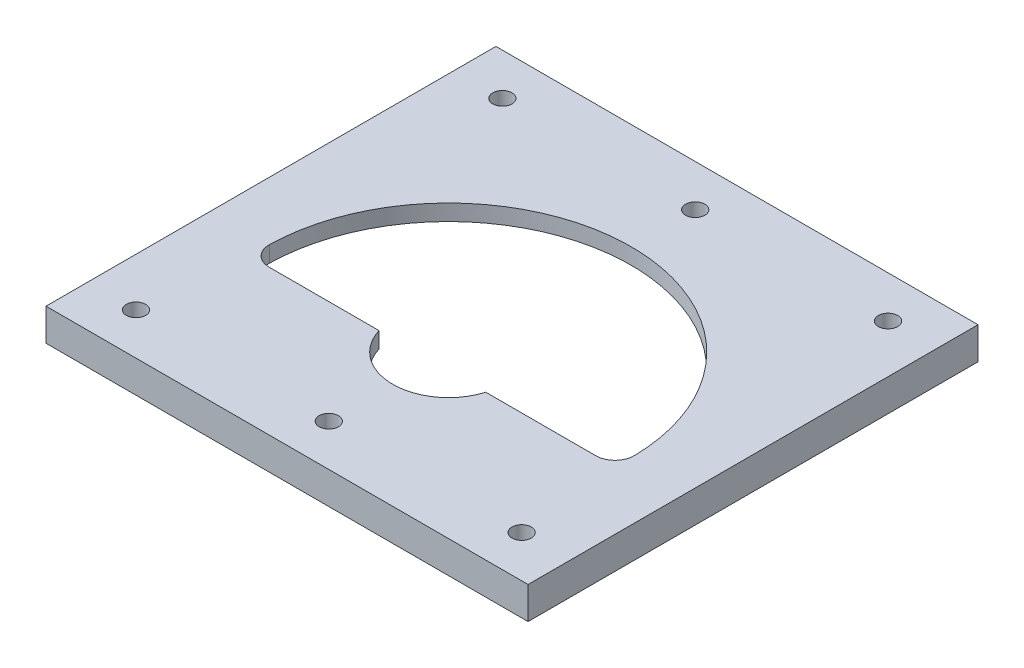
ISO-10303-21;
HEADER;
FILE_DESCRIPTION(('STEP AP214'),'2;1');
FILE_NAME('part.step','',(''),(''),'','','');
FILE_SCHEMA(('AUTOMOTIVE_DESIGN { 1 0 10303 214 1 1 1 1 }'));
ENDSEC;
DATA;
#1=APPLICATION_CONTEXT('core data for automotive mechanical design processes');
#2=APPLICATION_PROTOCOL_DEFINITION('international standard','automotive_design',2000,#1);
#3=PRODUCT_CONTEXT('',#1,'mechanical');
#4=PRODUCT('Part','Part','',(#3));
#5=PRODUCT_RELATED_PRODUCT_CATEGORY('part','',(#4));
#6=PRODUCT_DEFINITION_FORMATION('','',#4);
#7=PRODUCT_DEFINITION_CONTEXT('part definition',#1,'design');
#8=PRODUCT_DEFINITION('design','',#6,#7);
#9=PRODUCT_DEFINITION_SHAPE('','',#8);
#10=(LENGTH_UNIT() NAMED_UNIT(*) SI_UNIT(.MILLI.,.METRE.));
#11=(NAMED_UNIT(*) PLANE_ANGLE_UNIT() SI_UNIT($,.RADIAN.));
#12=(NAMED_UNIT(*) SI_UNIT($,.STERADIAN.) SOLID_ANGLE_UNIT());
#13=UNCERTAINTY_MEASURE_WITH_UNIT(LENGTH_MEASURE(1.E-05),#10,'distance_accuracy_value','');
#14=(GEOMETRIC_REPRESENTATION_CONTEXT(3) GLOBAL_UNCERTAINTY_ASSIGNED_CONTEXT((#13)) GLOBAL_UNIT_ASSIGNED_CONTEXT((#10,
#11,#12)) REPRESENTATION_CONTEXT('',''));
#15=CARTESIAN_POINT('',(0.,0.,0.));
#16=DIRECTION('',(0.,0.,1.));
#17=DIRECTION('',(1.,0.,0.));
#18=AXIS2_PLACEMENT_3D('',#15,#16,#17);
#19=CARTESIAN_POINT('',(25.4100183420751,5.,-0.5));
#20=DIRECTION('',(0.,-1.,0.));
#21=DIRECTION('',(0.,0.,-1.));
#22=AXIS2_PLACEMENT_3D('',#19,#20,#21);
#23=CYLINDRICAL_SURFACE('',#22,3.);
#24=DIRECTION('',(0.,-1.,0.));
#25=VECTOR('',#24,1.);
#26=CARTESIAN_POINT('',(28.4094377177648,5.,-0.559020409495822));
#27=LINE('',#26,#25);
#28=CARTESIAN_POINT('',(28.4094377177648,5.,-0.559020409495822));
#29=VERTEX_POINT('',#28);
#30=CARTESIAN_POINT('',(28.4094377177648,2.5,-0.559020409495822));
#31=VERTEX_POINT('',#30);
#32=EDGE_CURVE('E280',#29,#31,#27,.T.);
#33=ORIENTED_EDGE('',*,*,#32,.T.);
#34=CARTESIAN_POINT('',(25.4100183420751,2.5,-0.5));
#35=DIRECTION('',(0.,-1.,0.));
#36=DIRECTION('',(0.,0.,-1.));
#37=AXIS2_PLACEMENT_3D('',#34,#35,#36);
#38=CIRCLE('',#37,3.);
#39=CARTESIAN_POINT('',(25.4100183420751,2.5,2.5));
#40=VERTEX_POINT('',#39);
#41=EDGE_CURVE('E213',#31,#40,#38,.T.);
#42=ORIENTED_EDGE('',*,*,#41,.T.);
#43=DIRECTION('',(0.,-1.,0.));
#44=VECTOR('',#43,1.);
#45=CARTESIAN_POINT('',(25.4100183420751,5.,2.5));
#46=LINE('',#45,#44);
#47=CARTESIAN_POINT('',(25.4100183420751,5.,2.5));
#48=VERTEX_POINT('',#47);
#49=EDGE_CURVE('E265',#48,#40,#46,.T.);
#50=ORIENTED_EDGE('',*,*,#49,.F.);
#51=CARTESIAN_POINT('',(25.4100183420751,5.,-0.5));
#52=DIRECTION('',(0.,1.,0.));
#53=DIRECTION('',(0.,0.,1.));
#54=AXIS2_PLACEMENT_3D('',#51,#52,#53);
#55=CIRCLE('',#54,3.);
#56=EDGE_CURVE('E250',#48,#29,#55,.T.);
#57=ORIENTED_EDGE('',*,*,#56,.T.);
#58=EDGE_LOOP('',(#33,#42,#50,#57));
#59=FACE_BOUND('',#58,.T.);
#60=ADVANCED_FACE('F37',(#59),#23,.F.);
#61=CARTESIAN_POINT('',(0.,5.,0.));
#62=DIRECTION('',(0.,-1.,0.));
#63=DIRECTION('',(0.,0.,-1.));
#64=AXIS2_PLACEMENT_3D('',#61,#62,#63);
#65=CYLINDRICAL_SURFACE('',#64,28.4149371855331);
#66=DIRECTION('',(0.,-1.,0.));
#67=VECTOR('',#66,1.);
#68=CARTESIAN_POINT('',(-28.4094377177648,5.,-0.55902040949581));
#69=LINE('',#68,#67);
#70=CARTESIAN_POINT('',(-28.4094377177648,5.,-0.55902040949581));
#71=VERTEX_POINT('',#70);
#72=CARTESIAN_POINT('',(-28.4094377177648,2.5,-0.55902040949581));
#73=VERTEX_POINT('',#72);
#74=EDGE_CURVE('E277',#71,#73,#69,.T.);
#75=ORIENTED_EDGE('',*,*,#74,.T.);
#76=CARTESIAN_POINT('',(0.,2.5,0.));
#77=DIRECTION('',(0.,-1.,0.));
#78=DIRECTION('',(0.,0.,-1.));
#79=AXIS2_PLACEMENT_3D('',#76,#77,#78);
#80=CIRCLE('',#79,28.4149371855331);
#81=EDGE_CURVE('E210',#73,#31,#80,.T.);
#82=ORIENTED_EDGE('',*,*,#81,.T.);
#83=ORIENTED_EDGE('',*,*,#32,.F.);
#84=CARTESIAN_POINT('',(0.,5.,0.));
#85=DIRECTION('',(0.,1.,0.));
#86=DIRECTION('',(0.,0.,1.));
#87=AXIS2_PLACEMENT_3D('',#84,#85,#86);
#88=CIRCLE('',#87,28.4149371855331);
#89=EDGE_CURVE('E254',#29,#71,#88,.T.);
#90=ORIENTED_EDGE('',*,*,#89,.T.);
#91=EDGE_LOOP('',(#75,#82,#83,#90));
#92=FACE_BOUND('',#91,.T.);
#93=ADVANCED_FACE('F345',(#92),#65,.F.);
#94=CARTESIAN_POINT('',(-25.4100183420751,5.,-0.5));
#95=DIRECTION('',(0.,-1.,0.));
#96=DIRECTION('',(0.,0.,-1.));
#97=AXIS2_PLACEMENT_3D('',#94,#95,#96);
#98=CYLINDRICAL_SURFACE('',#97,3.);
#99=DIRECTION('',(0.,-1.,0.));
#100=VECTOR('',#99,1.);
#101=CARTESIAN_POINT('',(-25.4100183420751,5.,2.5));
#102=LINE('',#101,#100);
#103=CARTESIAN_POINT('',(-25.4100183420751,5.,2.5));
#104=VERTEX_POINT('',#103);
#105=CARTESIAN_POINT('',(-25.4100183420751,2.5,2.5));
#106=VERTEX_POINT('',#105);
#107=EDGE_CURVE('E274',#104,#106,#102,.T.);
#108=ORIENTED_EDGE('',*,*,#107,.T.);
#109=CARTESIAN_POINT('',(-25.4100183420751,2.5,-0.5));
#110=DIRECTION('',(0.,-1.,0.));
#111=DIRECTION('',(0.,0.,-1.));
#112=AXIS2_PLACEMENT_3D('',#109,#110,#111);
#113=CIRCLE('',#112,3.);
#114=EDGE_CURVE('E207',#106,#73,#113,.T.);
#115=ORIENTED_EDGE('',*,*,#114,.T.);
#116=ORIENTED_EDGE('',*,*,#74,.F.);
#117=CARTESIAN_POINT('',(-25.4100183420751,5.,-0.5));
#118=DIRECTION('',(0.,1.,0.));
#119=DIRECTION('',(0.,0.,1.));
#120=AXIS2_PLACEMENT_3D('',#117,#118,#119);
#121=CIRCLE('',#120,3.);
#122=EDGE_CURVE('E256',#71,#104,#121,.T.);
#123=ORIENTED_EDGE('',*,*,#122,.T.);
#124=EDGE_LOOP('',(#108,#115,#116,#123));
#125=FACE_BOUND('',#124,.T.);
#126=ADVANCED_FACE('F348',(#125),#98,.F.);
#127=CARTESIAN_POINT('',(-25.4100183420751,5.,2.5));
#128=DIRECTION('',(0.,0.,-1.));
#129=DIRECTION('',(-1.,0.,0.));
#130=AXIS2_PLACEMENT_3D('',#127,#128,#129);
#131=PLANE('',#130);
#132=DIRECTION('',(0.,-1.,0.));
#133=VECTOR('',#132,1.);
#134=CARTESIAN_POINT('',(-8.30696244122964,5.,2.5));
#135=LINE('',#134,#133);
#136=CARTESIAN_POINT('',(-8.30696244122964,5.,2.5));
#137=VERTEX_POINT('',#136);
#138=CARTESIAN_POINT('',(-8.30696244122964,2.5,2.5));
#139=VERTEX_POINT('',#138);
#140=EDGE_CURVE('E271',#137,#139,#135,.T.);
#141=ORIENTED_EDGE('',*,*,#140,.T.);
#142=DIRECTION('',(-1.,0.,0.));
#143=VECTOR('',#142,1.);
#144=CARTESIAN_POINT('',(-25.4100183420751,2.5,2.5));
#145=LINE('',#144,#143);
#146=EDGE_CURVE('E204',#139,#106,#145,.T.);
#147=ORIENTED_EDGE('',*,*,#146,.T.);
#148=ORIENTED_EDGE('',*,*,#107,.F.);
#149=DIRECTION('',(1.,0.,0.));
#150=VECTOR('',#149,1.);
#151=CARTESIAN_POINT('',(-25.4100183420751,5.,2.5));
#152=LINE('',#151,#150);
#153=EDGE_CURVE('E258',#104,#137,#152,.T.);
#154=ORIENTED_EDGE('',*,*,#153,.T.);
#155=EDGE_LOOP('',(#141,#147,#148,#154));
#156=FACE_BOUND('',#155,.T.);
#157=ADVANCED_FACE('F352',(#156),#131,.T.);
#158=CARTESIAN_POINT('',(0.,5.,0.));
#159=DIRECTION('',(0.,-1.,0.));
#160=DIRECTION('',(0.,0.,-1.));
#161=AXIS2_PLACEMENT_3D('',#158,#159,#160);
#162=CYLINDRICAL_SURFACE('',#161,8.675);
#163=DIRECTION('',(0.,-1.,0.));
#164=VECTOR('',#163,1.);
#165=CARTESIAN_POINT('',(8.30696244122965,5.,2.5));
#166=LINE('',#165,#164);
#167=CARTESIAN_POINT('',(8.30696244122965,5.,2.5));
#168=VERTEX_POINT('',#167);
#169=CARTESIAN_POINT('',(8.30696244122965,2.5,2.5));
#170=VERTEX_POINT('',#169);
#171=EDGE_CURVE('E268',#168,#170,#166,.T.);
#172=ORIENTED_EDGE('',*,*,#171,.T.);
#173=CARTESIAN_POINT('',(0.,2.5,0.));
#174=DIRECTION('',(0.,-1.,0.));
#175=DIRECTION('',(0.,0.,-1.));
#176=AXIS2_PLACEMENT_3D('',#173,#174,#175);
#177=CIRCLE('',#176,8.675);
#178=EDGE_CURVE('E60',#170,#139,#177,.T.);
#179=ORIENTED_EDGE('',*,*,#178,.T.);
#180=ORIENTED_EDGE('',*,*,#140,.F.);
#181=CARTESIAN_POINT('',(0.,5.,0.));
#182=DIRECTION('',(0.,1.,0.));
#183=DIRECTION('',(0.,0.,1.));
#184=AXIS2_PLACEMENT_3D('',#181,#182,#183);
#185=CIRCLE('',#184,8.675);
#186=EDGE_CURVE('E260',#137,#168,#185,.T.);
#187=ORIENTED_EDGE('',*,*,#186,.T.);
#188=EDGE_LOOP('',(#172,#179,#180,#187));
#189=FACE_BOUND('',#188,.T.);
#190=ADVANCED_FACE('F355',(#189),#162,.F.);
#191=CARTESIAN_POINT('',(8.30696244122964,5.,2.5));
#192=DIRECTION('',(0.,0.,-1.));
#193=DIRECTION('',(-1.,0.,0.));
#194=AXIS2_PLACEMENT_3D('',#191,#192,#193);
#195=PLANE('',#194);
#196=ORIENTED_EDGE('',*,*,#49,.T.);
#197=DIRECTION('',(-1.,0.,0.));
#198=VECTOR('',#197,1.);
#199=CARTESIAN_POINT('',(8.30696244122964,2.5,2.5));
#200=LINE('',#199,#198);
#201=EDGE_CURVE('E11',#40,#170,#200,.T.);
#202=ORIENTED_EDGE('',*,*,#201,.T.);
#203=ORIENTED_EDGE('',*,*,#171,.F.);
#204=DIRECTION('',(1.,0.,0.));
#205=VECTOR('',#204,1.);
#206=CARTESIAN_POINT('',(8.30696244122964,5.,2.5));
#207=LINE('',#206,#205);
#208=EDGE_CURVE('E263',#168,#48,#207,.T.);
#209=ORIENTED_EDGE('',*,*,#208,.T.);
#210=EDGE_LOOP('',(#196,#202,#203,#209));
#211=FACE_BOUND('',#210,.T.);
#212=ADVANCED_FACE('F333',(#211),#195,.T.);
#213=CARTESIAN_POINT('',(0.,5.,0.));
#214=DIRECTION('',(0.,-1.,0.));
#215=DIRECTION('',(0.,0.,-1.));
#216=AXIS2_PLACEMENT_3D('',#213,#214,#215);
#217=PLANE('',#216);
#218=CARTESIAN_POINT('',(-30.,5.,18.6175));
#219=DIRECTION('',(0.,1.,0.));
#220=DIRECTION('',(0.,0.,1.));
#221=AXIS2_PLACEMENT_3D('',#218,#219,#220);
#222=CIRCLE('',#221,1.5);
#223=CARTESIAN_POINT('',(-30.,5.,20.1175));
#224=VERTEX_POINT('',#223);
#225=EDGE_CURVE('E227',#224,#224,#222,.T.);
#226=ORIENTED_EDGE('',*,*,#225,.F.);
#227=EDGE_LOOP('',(#226));
#228=FACE_BOUND('',#227,.T.);
#229=CARTESIAN_POINT('',(0.,5.,18.6175));
#230=DIRECTION('',(0.,1.,0.));
#231=DIRECTION('',(0.,0.,1.));
#232=AXIS2_PLACEMENT_3D('',#229,#230,#231);
#233=CIRCLE('',#232,1.5);
#234=CARTESIAN_POINT('',(0.,5.,20.1175));
#235=VERTEX_POINT('',#234);
#236=EDGE_CURVE('E233',#235,#235,#233,.T.);
#237=ORIENTED_EDGE('',*,*,#236,.F.);
#238=EDGE_LOOP('',(#237));
#239=FACE_BOUND('',#238,.T.);
#240=CARTESIAN_POINT('',(30.,5.,18.6175));
#241=DIRECTION('',(0.,1.,0.));
#242=DIRECTION('',(0.,0.,1.));
#243=AXIS2_PLACEMENT_3D('',#240,#241,#242);
#244=CIRCLE('',#243,1.50000000000001);
#245=CARTESIAN_POINT('',(30.,5.,20.1175));
#246=VERTEX_POINT('',#245);
#247=EDGE_CURVE('E239',#246,#246,#244,.T.);
#248=ORIENTED_EDGE('',*,*,#247,.F.);
#249=EDGE_LOOP('',(#248));
#250=FACE_BOUND('',#249,.T.);
#251=CARTESIAN_POINT('',(30.,5.,-38.3825));
#252=DIRECTION('',(0.,1.,0.));
#253=DIRECTION('',(0.,0.,1.));
#254=AXIS2_PLACEMENT_3D('',#251,#252,#253);
#255=CIRCLE('',#254,1.50000000000001);
#256=CARTESIAN_POINT('',(30.,5.,-36.8825));
#257=VERTEX_POINT('',#256);
#258=EDGE_CURVE('E220',#257,#257,#255,.T.);
#259=ORIENTED_EDGE('',*,*,#258,.F.);
#260=EDGE_LOOP('',(#259));
#261=FACE_BOUND('',#260,.T.);
#262=CARTESIAN_POINT('',(0.,5.,-38.3825));
#263=DIRECTION('',(0.,1.,0.));
#264=DIRECTION('',(0.,0.,1.));
#265=AXIS2_PLACEMENT_3D('',#262,#263,#264);
#266=CIRCLE('',#265,1.5);
#267=CARTESIAN_POINT('',(0.,5.,-36.8825));
#268=VERTEX_POINT('',#267);
#269=EDGE_CURVE('E216',#268,#268,#266,.T.);
#270=ORIENTED_EDGE('',*,*,#269,.F.);
#271=EDGE_LOOP('',(#270));
#272=FACE_BOUND('',#271,.T.);
#273=CARTESIAN_POINT('',(-30.,5.,-38.3825));
#274=DIRECTION('',(0.,1.,0.));
#275=DIRECTION('',(0.,0.,1.));
#276=AXIS2_PLACEMENT_3D('',#273,#274,#275);
#277=CIRCLE('',#276,1.5);
#278=CARTESIAN_POINT('',(-30.,5.,-36.8825000000001));
#279=VERTEX_POINT('',#278);
#280=EDGE_CURVE('E226',#279,#279,#277,.T.);
#281=ORIENTED_EDGE('',*,*,#280,.F.);
#282=EDGE_LOOP('',(#281));
#283=FACE_BOUND('',#282,.T.);
#284=DIRECTION('',(0.,0.,1.));
#285=VECTOR('',#284,1.);
#286=CARTESIAN_POINT('',(-37.5,5.,25.1175));
#287=LINE('',#286,#285);
#288=CARTESIAN_POINT('',(-37.5,5.,-44.8825000000001));
#289=VERTEX_POINT('',#288);
#290=CARTESIAN_POINT('',(-37.5,5.,25.1175));
#291=VERTEX_POINT('',#290);
#292=EDGE_CURVE('E284',#289,#291,#287,.T.);
#293=ORIENTED_EDGE('',*,*,#292,.T.);
#294=DIRECTION('',(1.,0.,0.));
#295=VECTOR('',#294,1.);
#296=CARTESIAN_POINT('',(-37.5,5.,25.1175));
#297=LINE('',#296,#295);
#298=CARTESIAN_POINT('',(37.5,5.,25.1175));
#299=VERTEX_POINT('',#298);
#300=EDGE_CURVE('E287',#291,#299,#297,.T.);
#301=ORIENTED_EDGE('',*,*,#300,.T.);
#302=DIRECTION('',(0.,0.,-1.));
#303=VECTOR('',#302,1.);
#304=CARTESIAN_POINT('',(37.5,5.,25.1175));
#305=LINE('',#304,#303);
#306=CARTESIAN_POINT('',(37.5,5.,-44.8825000000001));
#307=VERTEX_POINT('',#306);
#308=EDGE_CURVE('E290',#299,#307,#305,.T.);
#309=ORIENTED_EDGE('',*,*,#308,.T.);
#310=DIRECTION('',(-1.,0.,0.));
#311=VECTOR('',#310,1.);
#312=CARTESIAN_POINT('',(-37.5,5.,-44.8825000000001));
#313=LINE('',#312,#311);
#314=EDGE_CURVE('E292',#307,#289,#313,.T.);
#315=ORIENTED_EDGE('',*,*,#314,.T.);
#316=EDGE_LOOP('',(#293,#301,#309,#315));
#317=FACE_BOUND('',#316,.T.);
#318=ORIENTED_EDGE('',*,*,#56,.F.);
#319=ORIENTED_EDGE('',*,*,#208,.F.);
#320=ORIENTED_EDGE('',*,*,#186,.F.);
#321=ORIENTED_EDGE('',*,*,#153,.F.);
#322=ORIENTED_EDGE('',*,*,#122,.F.);
#323=ORIENTED_EDGE('',*,*,#89,.F.);
#324=EDGE_LOOP('',(#318,#319,#320,#321,#322,#323));
#325=FACE_BOUND('',#324,.T.);
#326=ADVANCED_FACE('F330',(#228,#239,#250,#261,#272,#283,#317,#325),#217,.F.);
#327=CARTESIAN_POINT('',(0.,0.,0.));
#328=DIRECTION('',(0.,-1.,0.));
#329=DIRECTION('',(0.,0.,-1.));
#330=AXIS2_PLACEMENT_3D('',#327,#328,#329);
#331=PLANE('',#330);
#332=CARTESIAN_POINT('',(0.,0.,0.));
#333=DIRECTION('',(0.,-1.,0.));
#334=DIRECTION('',(0.,0.,-1.));
#335=AXIS2_PLACEMENT_3D('',#332,#333,#334);
#336=CIRCLE('',#335,13.675);
#337=CARTESIAN_POINT('',(11.4348425874605,0.,7.5));
#338=VERTEX_POINT('',#337);
#339=CARTESIAN_POINT('',(-11.4348425874605,0.,7.5));
#340=VERTEX_POINT('',#339);
#341=EDGE_CURVE('E52',#338,#340,#336,.T.);
#342=ORIENTED_EDGE('',*,*,#341,.F.);
#343=DIRECTION('',(-1.,0.,0.));
#344=VECTOR('',#343,1.);
#345=CARTESIAN_POINT('',(25.4100183420751,0.,7.5));
#346=LINE('',#345,#344);
#347=CARTESIAN_POINT('',(25.4100183420751,0.,7.5));
#348=VERTEX_POINT('',#347);
#349=EDGE_CURVE('E170',#348,#338,#346,.T.);
#350=ORIENTED_EDGE('',*,*,#349,.F.);
#351=CARTESIAN_POINT('',(25.4100183420751,0.,-0.5));
#352=DIRECTION('',(0.,-1.,0.));
#353=DIRECTION('',(0.,0.,-1.));
#354=AXIS2_PLACEMENT_3D('',#351,#352,#353);
#355=CIRCLE('',#354,8.);
#356=CARTESIAN_POINT('',(33.408470010581,0.,-0.657387758655486));
#357=VERTEX_POINT('',#356);
#358=EDGE_CURVE('E173',#357,#348,#355,.T.);
#359=ORIENTED_EDGE('',*,*,#358,.F.);
#360=CARTESIAN_POINT('',(0.,0.,0.));
#361=DIRECTION('',(0.,-1.,0.));
#362=DIRECTION('',(0.,0.,-1.));
#363=AXIS2_PLACEMENT_3D('',#360,#361,#362);
#364=CIRCLE('',#363,33.4149371855331);
#365=CARTESIAN_POINT('',(-33.408470010581,0.,-0.657387758655484));
#366=VERTEX_POINT('',#365);
#367=EDGE_CURVE('E189',#366,#357,#364,.T.);
#368=ORIENTED_EDGE('',*,*,#367,.F.);
#369=CARTESIAN_POINT('',(-25.4100183420751,0.,-0.5));
#370=DIRECTION('',(0.,-1.,0.));
#371=DIRECTION('',(0.,0.,-1.));
#372=AXIS2_PLACEMENT_3D('',#369,#370,#371);
#373=CIRCLE('',#372,8.);
#374=CARTESIAN_POINT('',(-25.4100183420751,0.,7.5));
#375=VERTEX_POINT('',#374);
#376=EDGE_CURVE('E186',#375,#366,#373,.T.);
#377=ORIENTED_EDGE('',*,*,#376,.F.);
#378=DIRECTION('',(-1.,0.,0.));
#379=VECTOR('',#378,1.);
#380=CARTESIAN_POINT('',(-11.4348425874605,0.,7.5));
#381=LINE('',#380,#379);
#382=EDGE_CURVE('E184',#340,#375,#381,.T.);
#383=ORIENTED_EDGE('',*,*,#382,.F.);
#384=EDGE_LOOP('',(#342,#350,#359,#368,#377,#383));
#385=FACE_BOUND('',#384,.T.);
#386=CARTESIAN_POINT('',(-30.,0.,18.6175));
#387=DIRECTION('',(0.,1.,0.));
#388=DIRECTION('',(0.,0.,1.));
#389=AXIS2_PLACEMENT_3D('',#386,#387,#388);
#390=CIRCLE('',#389,1.5);
#391=CARTESIAN_POINT('',(-30.,0.,20.1175));
#392=VERTEX_POINT('',#391);
#393=EDGE_CURVE('E223',#392,#392,#390,.T.);
#394=ORIENTED_EDGE('',*,*,#393,.T.);
#395=EDGE_LOOP('',(#394));
#396=FACE_BOUND('',#395,.T.);
#397=CARTESIAN_POINT('',(0.,0.,18.6175));
#398=DIRECTION('',(0.,1.,0.));
#399=DIRECTION('',(0.,0.,1.));
#400=AXIS2_PLACEMENT_3D('',#397,#398,#399);
#401=CIRCLE('',#400,1.5);
#402=CARTESIAN_POINT('',(0.,0.,20.1175));
#403=VERTEX_POINT('',#402);
#404=EDGE_CURVE('E230',#403,#403,#401,.T.);
#405=ORIENTED_EDGE('',*,*,#404,.T.);
#406=EDGE_LOOP('',(#405));
#407=FACE_BOUND('',#406,.T.);
#408=CARTESIAN_POINT('',(30.,0.,18.6175));
#409=DIRECTION('',(0.,1.,0.));
#410=DIRECTION('',(0.,0.,1.));
#411=AXIS2_PLACEMENT_3D('',#408,#409,#410);
#412=CIRCLE('',#411,1.50000000000001);
#413=CARTESIAN_POINT('',(30.,0.,20.1175));
#414=VERTEX_POINT('',#413);
#415=EDGE_CURVE('E236',#414,#414,#412,.T.);
#416=ORIENTED_EDGE('',*,*,#415,.T.);
#417=EDGE_LOOP('',(#416));
#418=FACE_BOUND('',#417,.T.);
#419=CARTESIAN_POINT('',(30.,0.,-38.3825));
#420=DIRECTION('',(0.,1.,0.));
#421=DIRECTION('',(0.,0.,1.));
#422=AXIS2_PLACEMENT_3D('',#419,#420,#421);
#423=CIRCLE('',#422,1.50000000000001);
#424=CARTESIAN_POINT('',(30.,0.,-36.8825));
#425=VERTEX_POINT('',#424);
#426=EDGE_CURVE('E242',#425,#425,#423,.T.);
#427=ORIENTED_EDGE('',*,*,#426,.T.);
#428=EDGE_LOOP('',(#427));
#429=FACE_BOUND('',#428,.T.);
#430=CARTESIAN_POINT('',(0.,0.,-38.3825));
#431=DIRECTION('',(0.,1.,0.));
#432=DIRECTION('',(0.,0.,1.));
#433=AXIS2_PLACEMENT_3D('',#430,#431,#432);
#434=CIRCLE('',#433,1.5);
#435=CARTESIAN_POINT('',(0.,0.,-36.8825));
#436=VERTEX_POINT('',#435);
#437=EDGE_CURVE('E217',#436,#436,#434,.T.);
#438=ORIENTED_EDGE('',*,*,#437,.T.);
#439=EDGE_LOOP('',(#438));
#440=FACE_BOUND('',#439,.T.);
#441=CARTESIAN_POINT('',(-30.,0.,-38.3825));
#442=DIRECTION('',(0.,1.,0.));
#443=DIRECTION('',(0.,0.,1.));
#444=AXIS2_PLACEMENT_3D('',#441,#442,#443);
#445=CIRCLE('',#444,1.5);
#446=CARTESIAN_POINT('',(-30.,0.,-36.8825000000001));
#447=VERTEX_POINT('',#446);
#448=EDGE_CURVE('E247',#447,#447,#445,.T.);
#449=ORIENTED_EDGE('',*,*,#448,.T.);
#450=EDGE_LOOP('',(#449));
#451=FACE_BOUND('',#450,.T.);
#452=DIRECTION('',(0.,0.,1.));
#453=VECTOR('',#452,1.);
#454=CARTESIAN_POINT('',(-37.5,0.,25.1175));
#455=LINE('',#454,#453);
#456=CARTESIAN_POINT('',(-37.5,0.,-44.8825000000001));
#457=VERTEX_POINT('',#456);
#458=CARTESIAN_POINT('',(-37.5,0.,25.1175));
#459=VERTEX_POINT('',#458);
#460=EDGE_CURVE('E283',#457,#459,#455,.T.);
#461=ORIENTED_EDGE('',*,*,#460,.F.);
#462=DIRECTION('',(-1.,0.,0.));
#463=VECTOR('',#462,1.);
#464=CARTESIAN_POINT('',(-37.5,0.,-44.8825000000001));
#465=LINE('',#464,#463);
#466=CARTESIAN_POINT('',(37.5,0.,-44.8825000000001));
#467=VERTEX_POINT('',#466);
#468=EDGE_CURVE('E288',#467,#457,#465,.T.);
#469=ORIENTED_EDGE('',*,*,#468,.F.);
#470=DIRECTION('',(0.,0.,-1.));
#471=VECTOR('',#470,1.);
#472=CARTESIAN_POINT('',(37.5,0.,25.1175));
#473=LINE('',#472,#471);
#474=CARTESIAN_POINT('',(37.5,0.,25.1175));
#475=VERTEX_POINT('',#474);
#476=EDGE_CURVE('E299',#475,#467,#473,.T.);
#477=ORIENTED_EDGE('',*,*,#476,.F.);
#478=DIRECTION('',(1.,0.,0.));
#479=VECTOR('',#478,1.);
#480=CARTESIAN_POINT('',(-37.5,0.,25.1175));
#481=LINE('',#480,#479);
#482=EDGE_CURVE('E297',#459,#475,#481,.T.);
#483=ORIENTED_EDGE('',*,*,#482,.F.);
#484=EDGE_LOOP('',(#461,#469,#477,#483));
#485=FACE_BOUND('',#484,.T.);
#486=ADVANCED_FACE('F320',(#385,#396,#407,#418,#429,#440,#451,#485),#331,.T.);
#487=CARTESIAN_POINT('',(-37.5,5.,25.1175));
#488=DIRECTION('',(1.,0.,0.));
#489=DIRECTION('',(0.,0.,-1.));
#490=AXIS2_PLACEMENT_3D('',#487,#488,#489);
#491=PLANE('',#490);
#492=ORIENTED_EDGE('',*,*,#460,.T.);
#493=DIRECTION('',(0.,-1.,0.));
#494=VECTOR('',#493,1.);
#495=CARTESIAN_POINT('',(-37.5,5.,25.1175));
#496=LINE('',#495,#494);
#497=EDGE_CURVE('E45',#291,#459,#496,.T.);
#498=ORIENTED_EDGE('',*,*,#497,.F.);
#499=ORIENTED_EDGE('',*,*,#292,.F.);
#500=DIRECTION('',(0.,-1.,0.));
#501=VECTOR('',#500,1.);
#502=CARTESIAN_POINT('',(-37.5,5.,-44.8825000000001));
#503=LINE('',#502,#501);
#504=EDGE_CURVE('E294',#289,#457,#503,.T.);
#505=ORIENTED_EDGE('',*,*,#504,.T.);
#506=EDGE_LOOP('',(#492,#498,#499,#505));
#507=FACE_BOUND('',#506,.T.);
#508=ADVANCED_FACE('F39',(#507),#491,.F.);
#509=CARTESIAN_POINT('',(-37.5,5.,25.1175));
#510=DIRECTION('',(0.,0.,-1.));
#511=DIRECTION('',(-1.,0.,0.));
#512=AXIS2_PLACEMENT_3D('',#509,#510,#511);
#513=PLANE('',#512);
#514=ORIENTED_EDGE('',*,*,#482,.T.);
#515=DIRECTION('',(0.,-1.,0.));
#516=VECTOR('',#515,1.);
#517=CARTESIAN_POINT('',(37.5,5.,25.1175));
#518=LINE('',#517,#516);
#519=EDGE_CURVE('E307',#299,#475,#518,.T.);
#520=ORIENTED_EDGE('',*,*,#519,.F.);
#521=ORIENTED_EDGE('',*,*,#300,.F.);
#522=ORIENTED_EDGE('',*,*,#497,.T.);
#523=EDGE_LOOP('',(#514,#520,#521,#522));
#524=FACE_BOUND('',#523,.T.);
#525=ADVANCED_FACE('F312',(#524),#513,.F.);
#526=CARTESIAN_POINT('',(37.5,5.,25.1175));
#527=DIRECTION('',(-1.,0.,0.));
#528=DIRECTION('',(0.,0.,1.));
#529=AXIS2_PLACEMENT_3D('',#526,#527,#528);
#530=PLANE('',#529);
#531=ORIENTED_EDGE('',*,*,#476,.T.);
#532=DIRECTION('',(0.,-1.,0.));
#533=VECTOR('',#532,1.);
#534=CARTESIAN_POINT('',(37.5,5.,-44.8825000000001));
#535=LINE('',#534,#533);
#536=EDGE_CURVE('E304',#307,#467,#535,.T.);
#537=ORIENTED_EDGE('',*,*,#536,.F.);
#538=ORIENTED_EDGE('',*,*,#308,.F.);
#539=ORIENTED_EDGE('',*,*,#519,.T.);
#540=EDGE_LOOP('',(#531,#537,#538,#539));
#541=FACE_BOUND('',#540,.T.);
#542=ADVANCED_FACE('F324',(#541),#530,.F.);
#543=CARTESIAN_POINT('',(-37.5,5.,-44.8825000000001));
#544=DIRECTION('',(0.,0.,1.));
#545=DIRECTION('',(1.,0.,0.));
#546=AXIS2_PLACEMENT_3D('',#543,#544,#545);
#547=PLANE('',#546);
#548=ORIENTED_EDGE('',*,*,#468,.T.);
#549=ORIENTED_EDGE('',*,*,#504,.F.);
#550=ORIENTED_EDGE('',*,*,#314,.F.);
#551=ORIENTED_EDGE('',*,*,#536,.T.);
#552=EDGE_LOOP('',(#548,#549,#550,#551));
#553=FACE_BOUND('',#552,.T.);
#554=ADVANCED_FACE('F328',(#553),#547,.F.);
#555=CARTESIAN_POINT('',(-30.,0.,-38.3825));
#556=DIRECTION('',(0.,1.,0.));
#557=DIRECTION('',(0.,0.,1.));
#558=AXIS2_PLACEMENT_3D('',#555,#556,#557);
#559=CYLINDRICAL_SURFACE('',#558,1.5);
#560=ORIENTED_EDGE('',*,*,#448,.F.);
#561=EDGE_LOOP('',(#560));
#562=FACE_BOUND('',#561,.T.);
#563=ORIENTED_EDGE('',*,*,#280,.T.);
#564=EDGE_LOOP('',(#563));
#565=FACE_BOUND('',#564,.T.);
#566=ADVANCED_FACE('F377',(#562,#565),#559,.F.);
#567=CARTESIAN_POINT('',(0.,0.,-38.3825));
#568=DIRECTION('',(0.,1.,0.));
#569=DIRECTION('',(0.,0.,1.));
#570=AXIS2_PLACEMENT_3D('',#567,#568,#569);
#571=CYLINDRICAL_SURFACE('',#570,1.5);
#572=ORIENTED_EDGE('',*,*,#437,.F.);
#573=EDGE_LOOP('',(#572));
#574=FACE_BOUND('',#573,.T.);
#575=ORIENTED_EDGE('',*,*,#269,.T.);
#576=EDGE_LOOP('',(#575));
#577=FACE_BOUND('',#576,.T.);
#578=ADVANCED_FACE('F408',(#574,#577),#571,.F.);
#579=CARTESIAN_POINT('',(30.,0.,-38.3825));
#580=DIRECTION('',(0.,1.,0.));
#581=DIRECTION('',(0.,0.,1.));
#582=AXIS2_PLACEMENT_3D('',#579,#580,#581);
#583=CYLINDRICAL_SURFACE('',#582,1.50000000000001);
#584=ORIENTED_EDGE('',*,*,#426,.F.);
#585=EDGE_LOOP('',(#584));
#586=FACE_BOUND('',#585,.T.);
#587=ORIENTED_EDGE('',*,*,#258,.T.);
#588=EDGE_LOOP('',(#587));
#589=FACE_BOUND('',#588,.T.);
#590=ADVANCED_FACE('F417',(#586,#589),#583,.F.);
#591=CARTESIAN_POINT('',(30.,0.,18.6175));
#592=DIRECTION('',(0.,1.,0.));
#593=DIRECTION('',(0.,0.,1.));
#594=AXIS2_PLACEMENT_3D('',#591,#592,#593);
#595=CYLINDRICAL_SURFACE('',#594,1.50000000000001);
#596=ORIENTED_EDGE('',*,*,#415,.F.);
#597=EDGE_LOOP('',(#596));
#598=FACE_BOUND('',#597,.T.);
#599=ORIENTED_EDGE('',*,*,#247,.T.);
#600=EDGE_LOOP('',(#599));
#601=FACE_BOUND('',#600,.T.);
#602=ADVANCED_FACE('F427',(#598,#601),#595,.F.);
#603=CARTESIAN_POINT('',(0.,0.,18.6175));
#604=DIRECTION('',(0.,1.,0.));
#605=DIRECTION('',(0.,0.,1.));
#606=AXIS2_PLACEMENT_3D('',#603,#604,#605);
#607=CYLINDRICAL_SURFACE('',#606,1.5);
#608=ORIENTED_EDGE('',*,*,#404,.F.);
#609=EDGE_LOOP('',(#608));
#610=FACE_BOUND('',#609,.T.);
#611=ORIENTED_EDGE('',*,*,#236,.T.);
#612=EDGE_LOOP('',(#611));
#613=FACE_BOUND('',#612,.T.);
#614=ADVANCED_FACE('F437',(#610,#613),#607,.F.);
#615=CARTESIAN_POINT('',(-30.,0.,18.6175));
#616=DIRECTION('',(0.,1.,0.));
#617=DIRECTION('',(0.,0.,1.));
#618=AXIS2_PLACEMENT_3D('',#615,#616,#617);
#619=CYLINDRICAL_SURFACE('',#618,1.5);
#620=ORIENTED_EDGE('',*,*,#393,.F.);
#621=EDGE_LOOP('',(#620));
#622=FACE_BOUND('',#621,.T.);
#623=ORIENTED_EDGE('',*,*,#225,.T.);
#624=EDGE_LOOP('',(#623));
#625=FACE_BOUND('',#624,.T.);
#626=ADVANCED_FACE('F447',(#622,#625),#619,.F.);
#627=CARTESIAN_POINT('',(0.,2.5,0.));
#628=DIRECTION('',(0.,-1.,0.));
#629=DIRECTION('',(0.,0.,-1.));
#630=AXIS2_PLACEMENT_3D('',#627,#628,#629);
#631=CYLINDRICAL_SURFACE('',#630,13.675);
#632=ORIENTED_EDGE('',*,*,#341,.T.);
#633=DIRECTION('',(0.,-1.,0.));
#634=VECTOR('',#633,1.);
#635=CARTESIAN_POINT('',(-11.4348425874605,2.5,7.5));
#636=LINE('',#635,#634);
#637=CARTESIAN_POINT('',(-11.4348425874605,2.5,7.5));
#638=VERTEX_POINT('',#637);
#639=EDGE_CURVE('E147',#638,#340,#636,.T.);
#640=ORIENTED_EDGE('',*,*,#639,.F.);
#641=CARTESIAN_POINT('',(0.,2.5,0.));
#642=DIRECTION('',(0.,-1.,0.));
#643=DIRECTION('',(0.,0.,-1.));
#644=AXIS2_PLACEMENT_3D('',#641,#642,#643);
#645=CIRCLE('',#644,13.675);
#646=CARTESIAN_POINT('',(11.4348425874605,2.5,7.5));
#647=VERTEX_POINT('',#646);
#648=EDGE_CURVE('E151',#647,#638,#645,.T.);
#649=ORIENTED_EDGE('',*,*,#648,.F.);
#650=DIRECTION('',(0.,-1.,0.));
#651=VECTOR('',#650,1.);
#652=CARTESIAN_POINT('',(11.4348425874605,2.5,7.5));
#653=LINE('',#652,#651);
#654=EDGE_CURVE('E194',#647,#338,#653,.T.);
#655=ORIENTED_EDGE('',*,*,#654,.T.);
#656=EDGE_LOOP('',(#632,#640,#649,#655));
#657=FACE_BOUND('',#656,.T.);
#658=ADVANCED_FACE('F149',(#657),#631,.F.);
#659=CARTESIAN_POINT('',(25.4100183420751,2.5,7.5));
#660=DIRECTION('',(0.,0.,1.));
#661=DIRECTION('',(1.,0.,0.));
#662=AXIS2_PLACEMENT_3D('',#659,#660,#661);
#663=PLANE('',#662);
#664=ORIENTED_EDGE('',*,*,#349,.T.);
#665=ORIENTED_EDGE('',*,*,#654,.F.);
#666=DIRECTION('',(-1.,0.,0.));
#667=VECTOR('',#666,1.);
#668=CARTESIAN_POINT('',(25.4100183420751,2.5,7.5));
#669=LINE('',#668,#667);
#670=CARTESIAN_POINT('',(25.4100183420751,2.5,7.5));
#671=VERTEX_POINT('',#670);
#672=EDGE_CURVE('E157',#671,#647,#669,.T.);
#673=ORIENTED_EDGE('',*,*,#672,.F.);
#674=DIRECTION('',(0.,-1.,0.));
#675=VECTOR('',#674,1.);
#676=CARTESIAN_POINT('',(25.4100183420751,2.5,7.5));
#677=LINE('',#676,#675);
#678=EDGE_CURVE('E196',#671,#348,#677,.T.);
#679=ORIENTED_EDGE('',*,*,#678,.T.);
#680=EDGE_LOOP('',(#664,#665,#673,#679));
#681=FACE_BOUND('',#680,.T.);
#682=ADVANCED_FACE('F501',(#681),#663,.F.);
#683=CARTESIAN_POINT('',(25.4100183420751,2.5,-0.5));
#684=DIRECTION('',(0.,-1.,0.));
#685=DIRECTION('',(0.,0.,-1.));
#686=AXIS2_PLACEMENT_3D('',#683,#684,#685);
#687=CYLINDRICAL_SURFACE('',#686,8.);
#688=ORIENTED_EDGE('',*,*,#358,.T.);
#689=ORIENTED_EDGE('',*,*,#678,.F.);
#690=CARTESIAN_POINT('',(25.4100183420751,2.5,-0.5));
#691=DIRECTION('',(0.,-1.,0.));
#692=DIRECTION('',(0.,0.,-1.));
#693=AXIS2_PLACEMENT_3D('',#690,#691,#692);
#694=CIRCLE('',#693,8.);
#695=CARTESIAN_POINT('',(33.408470010581,2.5,-0.657387758655486));
#696=VERTEX_POINT('',#695);
#697=EDGE_CURVE('E180',#696,#671,#694,.T.);
#698=ORIENTED_EDGE('',*,*,#697,.F.);
#699=DIRECTION('',(0.,-1.,0.));
#700=VECTOR('',#699,1.);
#701=CARTESIAN_POINT('',(33.408470010581,2.5,-0.657387758655486));
#702=LINE('',#701,#700);
#703=EDGE_CURVE('E198',#696,#357,#702,.T.);
#704=ORIENTED_EDGE('',*,*,#703,.T.);
#705=EDGE_LOOP('',(#688,#689,#698,#704));
#706=FACE_BOUND('',#705,.T.);
#707=ADVANCED_FACE('F509',(#706),#687,.F.);
#708=CARTESIAN_POINT('',(0.,2.5,0.));
#709=DIRECTION('',(0.,-1.,0.));
#710=DIRECTION('',(0.,0.,-1.));
#711=AXIS2_PLACEMENT_3D('',#708,#709,#710);
#712=CYLINDRICAL_SURFACE('',#711,33.4149371855331);
#713=ORIENTED_EDGE('',*,*,#367,.T.);
#714=ORIENTED_EDGE('',*,*,#703,.F.);
#715=CARTESIAN_POINT('',(0.,2.5,0.));
#716=DIRECTION('',(0.,-1.,0.));
#717=DIRECTION('',(0.,0.,-1.));
#718=AXIS2_PLACEMENT_3D('',#715,#716,#717);
#719=CIRCLE('',#718,33.4149371855331);
#720=CARTESIAN_POINT('',(-33.408470010581,2.5,-0.657387758655484));
#721=VERTEX_POINT('',#720);
#722=EDGE_CURVE('E177',#721,#696,#719,.T.);
#723=ORIENTED_EDGE('',*,*,#722,.F.);
#724=DIRECTION('',(0.,-1.,0.));
#725=VECTOR('',#724,1.);
#726=CARTESIAN_POINT('',(-33.408470010581,2.5,-0.657387758655484));
#727=LINE('',#726,#725);
#728=EDGE_CURVE('E200',#721,#366,#727,.T.);
#729=ORIENTED_EDGE('',*,*,#728,.T.);
#730=EDGE_LOOP('',(#713,#714,#723,#729));
#731=FACE_BOUND('',#730,.T.);
#732=ADVANCED_FACE('F518',(#731),#712,.F.);
#733=CARTESIAN_POINT('',(-25.4100183420751,2.5,-0.5));
#734=DIRECTION('',(0.,-1.,0.));
#735=DIRECTION('',(0.,0.,-1.));
#736=AXIS2_PLACEMENT_3D('',#733,#734,#735);
#737=CYLINDRICAL_SURFACE('',#736,8.);
#738=ORIENTED_EDGE('',*,*,#376,.T.);
#739=ORIENTED_EDGE('',*,*,#728,.F.);
#740=CARTESIAN_POINT('',(-25.4100183420751,2.5,-0.5));
#741=DIRECTION('',(0.,-1.,0.));
#742=DIRECTION('',(0.,0.,-1.));
#743=AXIS2_PLACEMENT_3D('',#740,#741,#742);
#744=CIRCLE('',#743,8.);
#745=CARTESIAN_POINT('',(-25.4100183420751,2.5,7.5));
#746=VERTEX_POINT('',#745);
#747=EDGE_CURVE('E165',#746,#721,#744,.T.);
#748=ORIENTED_EDGE('',*,*,#747,.F.);
#749=DIRECTION('',(0.,-1.,0.));
#750=VECTOR('',#749,1.);
#751=CARTESIAN_POINT('',(-25.4100183420751,2.5,7.5));
#752=LINE('',#751,#750);
#753=EDGE_CURVE('E156',#746,#375,#752,.T.);
#754=ORIENTED_EDGE('',*,*,#753,.T.);
#755=EDGE_LOOP('',(#738,#739,#748,#754));
#756=FACE_BOUND('',#755,.T.);
#757=ADVANCED_FACE('F527',(#756),#737,.F.);
#758=CARTESIAN_POINT('',(-11.4348425874605,2.5,7.5));
#759=DIRECTION('',(0.,0.,1.));
#760=DIRECTION('',(1.,0.,0.));
#761=AXIS2_PLACEMENT_3D('',#758,#759,#760);
#762=PLANE('',#761);
#763=ORIENTED_EDGE('',*,*,#382,.T.);
#764=ORIENTED_EDGE('',*,*,#753,.F.);
#765=DIRECTION('',(-1.,0.,0.));
#766=VECTOR('',#765,1.);
#767=CARTESIAN_POINT('',(-11.4348425874605,2.5,7.5));
#768=LINE('',#767,#766);
#769=EDGE_CURVE('E160',#638,#746,#768,.T.);
#770=ORIENTED_EDGE('',*,*,#769,.F.);
#771=ORIENTED_EDGE('',*,*,#639,.T.);
#772=EDGE_LOOP('',(#763,#764,#770,#771));
#773=FACE_BOUND('',#772,.T.);
#774=ADVANCED_FACE('F161',(#773),#762,.F.);
#775=CARTESIAN_POINT('',(0.,2.5,0.));
#776=DIRECTION('',(0.,-1.,0.));
#777=DIRECTION('',(0.,0.,-1.));
#778=AXIS2_PLACEMENT_3D('',#775,#776,#777);
#779=PLANE('',#778);
#780=ORIENTED_EDGE('',*,*,#81,.F.);
#781=ORIENTED_EDGE('',*,*,#114,.F.);
#782=ORIENTED_EDGE('',*,*,#146,.F.);
#783=ORIENTED_EDGE('',*,*,#178,.F.);
#784=ORIENTED_EDGE('',*,*,#201,.F.);
#785=ORIENTED_EDGE('',*,*,#41,.F.);
#786=EDGE_LOOP('',(#780,#781,#782,#783,#784,#785));
#787=FACE_BOUND('',#786,.T.);
#788=ORIENTED_EDGE('',*,*,#648,.T.);
#789=ORIENTED_EDGE('',*,*,#769,.T.);
#790=ORIENTED_EDGE('',*,*,#747,.T.);
#791=ORIENTED_EDGE('',*,*,#722,.T.);
#792=ORIENTED_EDGE('',*,*,#697,.T.);
#793=ORIENTED_EDGE('',*,*,#672,.T.);
#794=EDGE_LOOP('',(#788,#789,#790,#791,#792,#793));
#795=FACE_BOUND('',#794,.T.);
#796=ADVANCED_FACE('F167',(#787,#795),#779,.T.);
#797=CLOSED_SHELL('',(#60,#93,#126,#157,#190,#212,#326,#486,#508,#525,#542,#554,#566,#578,#590,
#602,#614,#626,#658,#682,#707,#732,#757,#774,#796));
#798=MANIFOLD_SOLID_BREP('B2',#797);
#799=ADVANCED_BREP_SHAPE_REPRESENTATION('',(#18,#798),#14);
#800=SHAPE_DEFINITION_REPRESENTATION(#9,#799);
ENDSEC;
END-ISO-10303-21;
